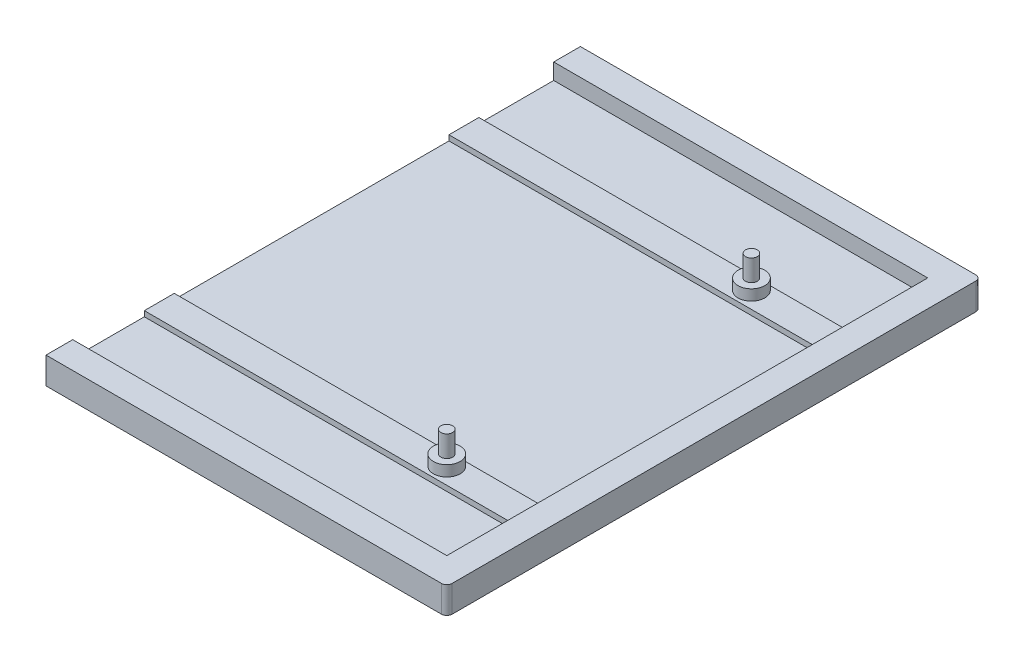
ISO-10303-21;
HEADER;
FILE_DESCRIPTION(('STEP AP214'),'2;1');
FILE_NAME('part.step','',(''),(''),'','','');
FILE_SCHEMA(('AUTOMOTIVE_DESIGN { 1 0 10303 214 1 1 1 1 }'));
ENDSEC;
DATA;
#1=APPLICATION_CONTEXT('core data for automotive mechanical design processes');
#2=APPLICATION_PROTOCOL_DEFINITION('international standard','automotive_design',2000,#1);
#3=PRODUCT_CONTEXT('',#1,'mechanical');
#4=PRODUCT('Part','Part','',(#3));
#5=PRODUCT_RELATED_PRODUCT_CATEGORY('part','',(#4));
#6=PRODUCT_DEFINITION_FORMATION('','',#4);
#7=PRODUCT_DEFINITION_CONTEXT('part definition',#1,'design');
#8=PRODUCT_DEFINITION('design','',#6,#7);
#9=PRODUCT_DEFINITION_SHAPE('','',#8);
#10=(LENGTH_UNIT() NAMED_UNIT(*) SI_UNIT(.MILLI.,.METRE.));
#11=(NAMED_UNIT(*) PLANE_ANGLE_UNIT() SI_UNIT($,.RADIAN.));
#12=(NAMED_UNIT(*) SI_UNIT($,.STERADIAN.) SOLID_ANGLE_UNIT());
#13=UNCERTAINTY_MEASURE_WITH_UNIT(LENGTH_MEASURE(1.E-05),#10,'distance_accuracy_value','');
#14=(GEOMETRIC_REPRESENTATION_CONTEXT(3) GLOBAL_UNCERTAINTY_ASSIGNED_CONTEXT((#13)) GLOBAL_UNIT_ASSIGNED_CONTEXT((#10,
#11,#12)) REPRESENTATION_CONTEXT('',''));
#15=CARTESIAN_POINT('',(0.,0.,0.));
#16=DIRECTION('',(0.,0.,1.));
#17=DIRECTION('',(1.,0.,0.));
#18=AXIS2_PLACEMENT_3D('',#15,#16,#17);
#19=CARTESIAN_POINT('',(283.126221244501,0.,-1.51049784776268E-05));
#20=DIRECTION('',(0.999999999999999,0.,-5.33506872349435E-08));
#21=DIRECTION('',(-5.33506872349435E-08,0.,-0.999999999999999));
#22=AXIS2_PLACEMENT_3D('',#19,#20,#21);
#23=PLANE('',#22);
#24=DIRECTION('',(0.,-1.,0.));
#25=VECTOR('',#24,1.);
#26=CARTESIAN_POINT('',(283.126213326985,5.,-148.405152672559));
#27=LINE('',#26,#25);
#28=CARTESIAN_POINT('',(283.126210659448,5.,-148.405152672559));
#29=VERTEX_POINT('',#28);
#30=CARTESIAN_POINT('',(283.126210659448,0.,-148.405152672559));
#31=VERTEX_POINT('',#30);
#32=EDGE_CURVE('E218',#29,#31,#27,.T.);
#33=ORIENTED_EDGE('',*,*,#32,.F.);
#34=DIRECTION('',(-5.33506872349435E-08,0.,-0.999999999999999));
#35=VECTOR('',#34,1.);
#36=CARTESIAN_POINT('',(283.126221244501,5.,-1.51049784776268E-05));
#37=LINE('',#36,#35);
#38=CARTESIAN_POINT('',(283.126210659448,5.,-153.405153415137));
#39=VERTEX_POINT('',#38);
#40=EDGE_CURVE('E222',#29,#39,#37,.T.);
#41=ORIENTED_EDGE('',*,*,#40,.T.);
#42=DIRECTION('',(0.,-1.,0.));
#43=VECTOR('',#42,1.);
#44=CARTESIAN_POINT('',(283.126213060231,5.,-153.405153415137));
#45=LINE('',#44,#43);
#46=CARTESIAN_POINT('',(283.126212702777,2.,-153.405153415137));
#47=VERTEX_POINT('',#46);
#48=EDGE_CURVE('E219',#39,#47,#45,.T.);
#49=ORIENTED_EDGE('',*,*,#48,.T.);
#50=DIRECTION('',(-5.33506872349435E-08,0.,-0.999999999999999));
#51=VECTOR('',#50,1.);
#52=CARTESIAN_POINT('',(283.126221244501,2.,-1.51049784776268E-05));
#53=LINE('',#52,#51);
#54=CARTESIAN_POINT('',(283.126212702777,2.,-166.805313068658));
#55=VERTEX_POINT('',#54);
#56=EDGE_CURVE('E226',#47,#55,#53,.T.);
#57=ORIENTED_EDGE('',*,*,#56,.T.);
#58=DIRECTION('',(0.,-1.,0.));
#59=VECTOR('',#58,1.);
#60=CARTESIAN_POINT('',(283.126212345323,3.,-166.805313068658));
#61=LINE('',#60,#59);
#62=CARTESIAN_POINT('',(283.126212345323,3.,-166.805313068658));
#63=VERTEX_POINT('',#62);
#64=EDGE_CURVE('E344',#63,#55,#61,.T.);
#65=ORIENTED_EDGE('',*,*,#64,.F.);
#66=DIRECTION('',(5.33506872349435E-08,0.,0.999999999999999));
#67=VECTOR('',#66,1.);
#68=CARTESIAN_POINT('',(283.126221244501,3.,-1.51049784776268E-05));
#69=LINE('',#68,#67);
#70=CARTESIAN_POINT('',(283.12621204656,3.,-172.405304582281));
#71=VERTEX_POINT('',#70);
#72=EDGE_CURVE('E336',#71,#63,#69,.T.);
#73=ORIENTED_EDGE('',*,*,#72,.F.);
#74=DIRECTION('',(0.,1.,0.));
#75=VECTOR('',#74,1.);
#76=CARTESIAN_POINT('',(283.12621204656,3.,-172.405304582281));
#77=LINE('',#76,#75);
#78=CARTESIAN_POINT('',(283.126210675444,2.,-172.405304582281));
#79=VERTEX_POINT('',#78);
#80=EDGE_CURVE('E191',#79,#71,#77,.T.);
#81=ORIENTED_EDGE('',*,*,#80,.F.);
#82=DIRECTION('',(-5.33506872349435E-08,0.,-0.999999999999999));
#83=VECTOR('',#82,1.);
#84=CARTESIAN_POINT('',(283.126221244501,2.,-1.51049784776268E-05));
#85=LINE('',#84,#83);
#86=CARTESIAN_POINT('',(283.126210675444,2.,-223.805428582459));
#87=VERTEX_POINT('',#86);
#88=EDGE_CURVE('E41',#79,#87,#85,.T.);
#89=ORIENTED_EDGE('',*,*,#88,.T.);
#90=DIRECTION('',(0.,-1.,0.));
#91=VECTOR('',#90,1.);
#92=CARTESIAN_POINT('',(283.126209304328,3.,-223.805428582459));
#93=LINE('',#92,#91);
#94=CARTESIAN_POINT('',(283.126209154946,3.,-223.805428582459));
#95=VERTEX_POINT('',#94);
#96=EDGE_CURVE('E180',#95,#87,#93,.T.);
#97=ORIENTED_EDGE('',*,*,#96,.F.);
#98=DIRECTION('',(5.33506872349435E-08,0.,0.999999999999999));
#99=VECTOR('',#98,1.);
#100=CARTESIAN_POINT('',(283.126221244501,3.,-1.51049784776268E-05));
#101=LINE('',#100,#99);
#102=CARTESIAN_POINT('',(283.126209154946,3.,-229.405435317784));
#103=VERTEX_POINT('',#102);
#104=EDGE_CURVE('E352',#103,#95,#101,.T.);
#105=ORIENTED_EDGE('',*,*,#104,.F.);
#106=DIRECTION('',(0.,1.,0.));
#107=VECTOR('',#106,1.);
#108=CARTESIAN_POINT('',(283.126209005564,3.,-229.405435317784));
#109=LINE('',#108,#107);
#110=CARTESIAN_POINT('',(283.126208632114,2.,-229.405435317784));
#111=VERTEX_POINT('',#110);
#112=EDGE_CURVE('E190',#111,#103,#109,.T.);
#113=ORIENTED_EDGE('',*,*,#112,.F.);
#114=DIRECTION('',(-5.33506872349435E-08,0.,-0.999999999999999));
#115=VECTOR('',#114,1.);
#116=CARTESIAN_POINT('',(283.126221244501,2.,-1.51049784776268E-05));
#117=LINE('',#116,#115);
#118=CARTESIAN_POINT('',(283.126208632114,2.,-243.405241308847));
#119=VERTEX_POINT('',#118);
#120=EDGE_CURVE('E196',#111,#119,#117,.T.);
#121=ORIENTED_EDGE('',*,*,#120,.T.);
#122=DIRECTION('',(0.,1.,0.));
#123=VECTOR('',#122,1.);
#124=CARTESIAN_POINT('',(283.126208258665,5.,-243.405241308847));
#125=LINE('',#124,#123);
#126=CARTESIAN_POINT('',(283.126210659448,5.,-243.405241308847));
#127=VERTEX_POINT('',#126);
#128=EDGE_CURVE('E215',#119,#127,#125,.T.);
#129=ORIENTED_EDGE('',*,*,#128,.T.);
#130=CARTESIAN_POINT('',(283.126210659448,5.,-248.405241308848));
#131=VERTEX_POINT('',#130);
#132=EDGE_CURVE('E223',#127,#131,#37,.T.);
#133=ORIENTED_EDGE('',*,*,#132,.T.);
#134=DIRECTION('',(0.,1.,0.));
#135=VECTOR('',#134,1.);
#136=CARTESIAN_POINT('',(283.126207991911,5.,-248.405241308847));
#137=LINE('',#136,#135);
#138=CARTESIAN_POINT('',(283.126210659448,0.,-248.405241308848));
#139=VERTEX_POINT('',#138);
#140=EDGE_CURVE('E349',#139,#131,#137,.T.);
#141=ORIENTED_EDGE('',*,*,#140,.F.);
#142=DIRECTION('',(-5.33506872349435E-08,0.,-0.999999999999999));
#143=VECTOR('',#142,1.);
#144=CARTESIAN_POINT('',(283.126221244501,0.,-1.51049784776268E-05));
#145=LINE('',#144,#143);
#146=EDGE_CURVE('E346',#31,#139,#145,.T.);
#147=ORIENTED_EDGE('',*,*,#146,.F.);
#148=EDGE_LOOP('',(#33,#41,#49,#57,#65,#73,#81,#89,#97,#105,#113,#121,#129,#133,#141,#147));
#149=FACE_BOUND('',#148,.T.);
#150=ADVANCED_FACE('F37',(#149),#23,.F.);
#151=CARTESIAN_POINT('',(0.,9.,0.));
#152=DIRECTION('',(0.,1.,0.));
#153=DIRECTION('',(0.,0.,1.));
#154=AXIS2_PLACEMENT_3D('',#151,#152,#153);
#155=PLANE('',#154);
#156=CARTESIAN_POINT('',(336.626405872607,9.,-226.905435317784));
#157=DIRECTION('',(0.,1.,0.));
#158=DIRECTION('',(0.,0.,1.));
#159=AXIS2_PLACEMENT_3D('',#156,#157,#158);
#160=CIRCLE('',#159,1.10000000000005);
#161=CARTESIAN_POINT('',(336.626405872607,9.,-225.805435317784));
#162=VERTEX_POINT('',#161);
#163=EDGE_CURVE('E321',#162,#162,#160,.T.);
#164=ORIENTED_EDGE('',*,*,#163,.T.);
#165=EDGE_LOOP('',(#164));
#166=FACE_BOUND('',#165,.T.);
#167=ADVANCED_FACE('F430',(#166),#155,.T.);
#168=CARTESIAN_POINT('',(0.,9.,0.));
#169=DIRECTION('',(0.,1.,0.));
#170=DIRECTION('',(0.,0.,1.));
#171=AXIS2_PLACEMENT_3D('',#168,#169,#170);
#172=PLANE('',#171);
#173=CARTESIAN_POINT('',(336.626405872607,9.,-169.905319803983));
#174=DIRECTION('',(0.,1.,0.));
#175=DIRECTION('',(0.,0.,1.));
#176=AXIS2_PLACEMENT_3D('',#173,#174,#175);
#177=CIRCLE('',#176,1.10000000000005);
#178=CARTESIAN_POINT('',(336.626405872607,9.,-168.805319803983));
#179=VERTEX_POINT('',#178);
#180=EDGE_CURVE('E11',#179,#179,#177,.T.);
#181=ORIENTED_EDGE('',*,*,#180,.T.);
#182=EDGE_LOOP('',(#181));
#183=FACE_BOUND('',#182,.T.);
#184=ADVANCED_FACE('F435',(#183),#172,.T.);
#185=CARTESIAN_POINT('',(336.626405872607,9.,-226.905435317784));
#186=DIRECTION('',(0.,-1.,0.));
#187=DIRECTION('',(0.,0.,-1.));
#188=AXIS2_PLACEMENT_3D('',#185,#186,#187);
#189=CYLINDRICAL_SURFACE('',#188,1.10000000000005);
#190=ORIENTED_EDGE('',*,*,#163,.F.);
#191=EDGE_LOOP('',(#190));
#192=FACE_BOUND('',#191,.T.);
#193=CARTESIAN_POINT('',(336.626405872607,5.,-226.905435317784));
#194=DIRECTION('',(0.,1.,0.));
#195=DIRECTION('',(0.,0.,1.));
#196=AXIS2_PLACEMENT_3D('',#193,#194,#195);
#197=CIRCLE('',#196,1.10000000000005);
#198=CARTESIAN_POINT('',(336.626405872607,5.,-225.805435317784));
#199=VERTEX_POINT('',#198);
#200=EDGE_CURVE('E318',#199,#199,#197,.T.);
#201=ORIENTED_EDGE('',*,*,#200,.T.);
#202=EDGE_LOOP('',(#201));
#203=FACE_BOUND('',#202,.T.);
#204=ADVANCED_FACE('F464',(#192,#203),#189,.T.);
#205=CARTESIAN_POINT('',(336.626405872607,9.,-169.905319803983));
#206=DIRECTION('',(0.,-1.,0.));
#207=DIRECTION('',(0.,0.,-1.));
#208=AXIS2_PLACEMENT_3D('',#205,#206,#207);
#209=CYLINDRICAL_SURFACE('',#208,1.10000000000005);
#210=ORIENTED_EDGE('',*,*,#180,.F.);
#211=EDGE_LOOP('',(#210));
#212=FACE_BOUND('',#211,.T.);
#213=CARTESIAN_POINT('',(336.626405872607,5.,-169.905319803983));
#214=DIRECTION('',(0.,1.,0.));
#215=DIRECTION('',(0.,0.,1.));
#216=AXIS2_PLACEMENT_3D('',#213,#214,#215);
#217=CIRCLE('',#216,1.10000000000005);
#218=CARTESIAN_POINT('',(336.626405872607,5.,-168.805319803983));
#219=VERTEX_POINT('',#218);
#220=EDGE_CURVE('E46',#219,#219,#217,.T.);
#221=ORIENTED_EDGE('',*,*,#220,.T.);
#222=EDGE_LOOP('',(#221));
#223=FACE_BOUND('',#222,.T.);
#224=ADVANCED_FACE('F462',(#212,#223),#209,.T.);
#225=CARTESIAN_POINT('',(0.,5.,0.));
#226=DIRECTION('',(0.,1.,0.));
#227=DIRECTION('',(0.,0.,1.));
#228=AXIS2_PLACEMENT_3D('',#225,#226,#227);
#229=PLANE('',#228);
#230=ORIENTED_EDGE('',*,*,#200,.F.);
#231=EDGE_LOOP('',(#230));
#232=FACE_BOUND('',#231,.T.);
#233=CARTESIAN_POINT('',(336.626405872607,5.,-226.905435317784));
#234=DIRECTION('',(0.,1.,0.));
#235=DIRECTION('',(0.,0.,1.));
#236=AXIS2_PLACEMENT_3D('',#233,#234,#235);
#237=CIRCLE('',#236,2.50000000000002);
#238=CARTESIAN_POINT('',(336.626405872607,5.,-224.405435317784));
#239=VERTEX_POINT('',#238);
#240=EDGE_CURVE('E205',#239,#239,#237,.T.);
#241=ORIENTED_EDGE('',*,*,#240,.T.);
#242=EDGE_LOOP('',(#241));
#243=FACE_BOUND('',#242,.T.);
#244=ADVANCED_FACE('F458',(#232,#243),#229,.T.);
#245=CARTESIAN_POINT('',(0.,5.,0.));
#246=DIRECTION('',(0.,1.,0.));
#247=DIRECTION('',(0.,0.,1.));
#248=AXIS2_PLACEMENT_3D('',#245,#246,#247);
#249=PLANE('',#248);
#250=ORIENTED_EDGE('',*,*,#220,.F.);
#251=EDGE_LOOP('',(#250));
#252=FACE_BOUND('',#251,.T.);
#253=CARTESIAN_POINT('',(336.626405872607,5.,-169.905319803983));
#254=DIRECTION('',(0.,1.,0.));
#255=DIRECTION('',(0.,0.,1.));
#256=AXIS2_PLACEMENT_3D('',#253,#254,#255);
#257=CIRCLE('',#256,2.50000000000002);
#258=CARTESIAN_POINT('',(336.626405872607,5.,-167.405319803983));
#259=VERTEX_POINT('',#258);
#260=EDGE_CURVE('E272',#259,#259,#257,.T.);
#261=ORIENTED_EDGE('',*,*,#260,.T.);
#262=EDGE_LOOP('',(#261));
#263=FACE_BOUND('',#262,.T.);
#264=ADVANCED_FACE('F461',(#252,#263),#249,.T.);
#265=CARTESIAN_POINT('',(0.,3.,0.));
#266=DIRECTION('',(0.,-1.,0.));
#267=DIRECTION('',(0.,0.,-1.));
#268=AXIS2_PLACEMENT_3D('',#265,#266,#267);
#269=PLANE('',#268);
#270=DIRECTION('',(-1.,0.,0.));
#271=VECTOR('',#270,1.);
#272=CARTESIAN_POINT('',(54.1264415400261,3.,-172.405304582281));
#273=LINE('',#272,#271);
#274=CARTESIAN_POINT('',(336.617681866791,3.,-172.405304582281));
#275=VERTEX_POINT('',#274);
#276=EDGE_CURVE('E255',#275,#71,#273,.T.);
#277=ORIENTED_EDGE('',*,*,#276,.T.);
#278=ORIENTED_EDGE('',*,*,#72,.T.);
#279=DIRECTION('',(1.,0.,0.));
#280=VECTOR('',#279,1.);
#281=CARTESIAN_POINT('',(353.126212345323,3.,-166.805313068658));
#282=LINE('',#281,#280);
#283=CARTESIAN_POINT('',(353.126212345323,3.,-166.805313068658));
#284=VERTEX_POINT('',#283);
#285=EDGE_CURVE('E211',#63,#284,#282,.T.);
#286=ORIENTED_EDGE('',*,*,#285,.T.);
#287=DIRECTION('',(-5.33506885107468E-08,0.,-0.999999999999999));
#288=VECTOR('',#287,1.);
#289=CARTESIAN_POINT('',(353.12621204656,3.,-172.405304582281));
#290=LINE('',#289,#288);
#291=CARTESIAN_POINT('',(353.12621204656,3.,-172.405304582281));
#292=VERTEX_POINT('',#291);
#293=EDGE_CURVE('E258',#284,#292,#290,.T.);
#294=ORIENTED_EDGE('',*,*,#293,.T.);
#295=CARTESIAN_POINT('',(336.635129878423,3.,-172.405304582281));
#296=VERTEX_POINT('',#295);
#297=EDGE_CURVE('E252',#292,#296,#273,.T.);
#298=ORIENTED_EDGE('',*,*,#297,.T.);
#299=CARTESIAN_POINT('',(336.626405872607,3.,-169.905319803983));
#300=DIRECTION('',(0.,-1.,0.));
#301=DIRECTION('',(0.,0.,-1.));
#302=AXIS2_PLACEMENT_3D('',#299,#300,#301);
#303=CIRCLE('',#302,2.50000000000002);
#304=EDGE_CURVE('E62',#275,#296,#303,.F.);
#305=ORIENTED_EDGE('',*,*,#304,.F.);
#306=EDGE_LOOP('',(#277,#278,#286,#294,#298,#305));
#307=FACE_BOUND('',#306,.T.);
#308=ADVANCED_FACE('F334',(#307),#269,.F.);
#309=CARTESIAN_POINT('',(336.626405872607,5.,-226.905435317784));
#310=DIRECTION('',(0.,-1.,0.));
#311=DIRECTION('',(0.,0.,-1.));
#312=AXIS2_PLACEMENT_3D('',#309,#310,#311);
#313=CYLINDRICAL_SURFACE('',#312,2.50000000000002);
#314=ORIENTED_EDGE('',*,*,#240,.F.);
#315=EDGE_LOOP('',(#314));
#316=FACE_BOUND('',#315,.T.);
#317=CARTESIAN_POINT('',(336.626405872607,3.,-226.905435317784));
#318=DIRECTION('',(0.,-1.,0.));
#319=DIRECTION('',(0.,0.,-1.));
#320=AXIS2_PLACEMENT_3D('',#317,#318,#319);
#321=CIRCLE('',#320,2.50000000000002);
#322=CARTESIAN_POINT('',(336.626405872607,3.,-229.405435317784));
#323=VERTEX_POINT('',#322);
#324=EDGE_CURVE('E201',#323,#323,#321,.F.);
#325=ORIENTED_EDGE('',*,*,#324,.T.);
#326=EDGE_LOOP('',(#325));
#327=FACE_BOUND('',#326,.T.);
#328=ADVANCED_FACE('F454',(#316,#327),#313,.T.);
#329=CARTESIAN_POINT('',(353.126212345323,3.,-166.805313068658));
#330=DIRECTION('',(0.,0.,-1.));
#331=DIRECTION('',(-1.,0.,0.));
#332=AXIS2_PLACEMENT_3D('',#329,#330,#331);
#333=PLANE('',#332);
#334=ORIENTED_EDGE('',*,*,#285,.F.);
#335=ORIENTED_EDGE('',*,*,#64,.T.);
#336=DIRECTION('',(1.,0.,0.));
#337=VECTOR('',#336,1.);
#338=CARTESIAN_POINT('',(353.126212345323,2.,-166.805313068658));
#339=LINE('',#338,#337);
#340=CARTESIAN_POINT('',(353.126212345323,2.,-166.805313068658));
#341=VERTEX_POINT('',#340);
#342=EDGE_CURVE('E256',#55,#341,#339,.T.);
#343=ORIENTED_EDGE('',*,*,#342,.T.);
#344=DIRECTION('',(0.,-1.,0.));
#345=VECTOR('',#344,1.);
#346=CARTESIAN_POINT('',(353.126212345323,3.,-166.805313068658));
#347=LINE('',#346,#345);
#348=EDGE_CURVE('E325',#284,#341,#347,.T.);
#349=ORIENTED_EDGE('',*,*,#348,.F.);
#350=EDGE_LOOP('',(#334,#335,#343,#349));
#351=FACE_BOUND('',#350,.T.);
#352=ADVANCED_FACE('F339',(#351),#333,.F.);
#353=CARTESIAN_POINT('',(-4.63593180367697E-06,5.,-243.405235916384));
#354=DIRECTION('',(1.90461465885209E-08,0.,1.));
#355=DIRECTION('',(1.,0.,-1.90461465885209E-08));
#356=AXIS2_PLACEMENT_3D('',#353,#354,#355);
#357=PLANE('',#356);
#358=ORIENTED_EDGE('',*,*,#128,.F.);
#359=DIRECTION('',(-1.,0.,1.90461465885209E-08));
#360=VECTOR('',#359,1.);
#361=CARTESIAN_POINT('',(-4.63593180367697E-06,2.,-243.405235916384));
#362=LINE('',#361,#360);
#363=CARTESIAN_POINT('',(353.126208258665,2.,-243.405242642078));
#364=VERTEX_POINT('',#363);
#365=EDGE_CURVE('E234',#364,#119,#362,.T.);
#366=ORIENTED_EDGE('',*,*,#365,.F.);
#367=DIRECTION('',(0.,-1.,0.));
#368=VECTOR('',#367,1.);
#369=CARTESIAN_POINT('',(353.126208258665,5.,-243.405242642078));
#370=LINE('',#369,#368);
#371=CARTESIAN_POINT('',(353.126208258665,5.,-243.405242642078));
#372=VERTEX_POINT('',#371);
#373=EDGE_CURVE('E281',#372,#364,#370,.T.);
#374=ORIENTED_EDGE('',*,*,#373,.F.);
#375=DIRECTION('',(-1.,0.,1.90461465885209E-08));
#376=VECTOR('',#375,1.);
#377=CARTESIAN_POINT('',(-4.63593180367697E-06,5.,-243.405235916384));
#378=LINE('',#377,#376);
#379=EDGE_CURVE('E284',#372,#127,#378,.T.);
#380=ORIENTED_EDGE('',*,*,#379,.T.);
#381=EDGE_LOOP('',(#358,#366,#374,#380));
#382=FACE_BOUND('',#381,.T.);
#383=ADVANCED_FACE('F408',(#382),#357,.T.);
#384=CARTESIAN_POINT('',(54.1264415400261,3.,-223.805428582459));
#385=DIRECTION('',(0.,0.,-1.));
#386=DIRECTION('',(-1.,0.,0.));
#387=AXIS2_PLACEMENT_3D('',#384,#385,#386);
#388=PLANE('',#387);
#389=DIRECTION('',(1.,0.,0.));
#390=VECTOR('',#389,1.);
#391=CARTESIAN_POINT('',(54.1264415400261,3.,-223.805428582459));
#392=LINE('',#391,#390);
#393=CARTESIAN_POINT('',(353.126209304328,3.,-223.805428582459));
#394=VERTEX_POINT('',#393);
#395=EDGE_CURVE('E187',#95,#394,#392,.T.);
#396=ORIENTED_EDGE('',*,*,#395,.F.);
#397=ORIENTED_EDGE('',*,*,#96,.T.);
#398=DIRECTION('',(1.,0.,0.));
#399=VECTOR('',#398,1.);
#400=CARTESIAN_POINT('',(54.1264415400261,2.,-223.805428582459));
#401=LINE('',#400,#399);
#402=CARTESIAN_POINT('',(353.126209304328,2.,-223.805428582459));
#403=VERTEX_POINT('',#402);
#404=EDGE_CURVE('E185',#87,#403,#401,.T.);
#405=ORIENTED_EDGE('',*,*,#404,.T.);
#406=DIRECTION('',(0.,-1.,0.));
#407=VECTOR('',#406,1.);
#408=CARTESIAN_POINT('',(353.126209304328,3.,-223.805428582459));
#409=LINE('',#408,#407);
#410=EDGE_CURVE('E307',#394,#403,#409,.T.);
#411=ORIENTED_EDGE('',*,*,#410,.F.);
#412=EDGE_LOOP('',(#396,#397,#405,#411));
#413=FACE_BOUND('',#412,.T.);
#414=ADVANCED_FACE('F182',(#413),#388,.F.);
#415=CARTESIAN_POINT('',(353.126221244501,5.,-1.88395267128549E-05));
#416=DIRECTION('',(-0.999999999999999,0.,5.33506875996349E-08));
#417=DIRECTION('',(5.33506875996349E-08,0.,0.999999999999999));
#418=AXIS2_PLACEMENT_3D('',#415,#416,#417);
#419=PLANE('',#418);
#420=DIRECTION('',(-5.33506875996349E-08,0.,-0.999999999999999));
#421=VECTOR('',#420,1.);
#422=CARTESIAN_POINT('',(353.126221244501,2.,-1.88395267128549E-05));
#423=LINE('',#422,#421);
#424=CARTESIAN_POINT('',(353.126209005564,2.,-229.405435317784));
#425=VERTEX_POINT('',#424);
#426=EDGE_CURVE('E237',#425,#364,#423,.T.);
#427=ORIENTED_EDGE('',*,*,#426,.F.);
#428=DIRECTION('',(0.,-1.,0.));
#429=VECTOR('',#428,1.);
#430=CARTESIAN_POINT('',(353.126209005564,3.,-229.405435317784));
#431=LINE('',#430,#429);
#432=CARTESIAN_POINT('',(353.126209005564,3.,-229.405435317784));
#433=VERTEX_POINT('',#432);
#434=EDGE_CURVE('E309',#433,#425,#431,.T.);
#435=ORIENTED_EDGE('',*,*,#434,.F.);
#436=DIRECTION('',(-5.33506921855642E-08,0.,-0.999999999999999));
#437=VECTOR('',#436,1.);
#438=CARTESIAN_POINT('',(353.126209005564,3.,-229.405435317784));
#439=LINE('',#438,#437);
#440=EDGE_CURVE('E214',#394,#433,#439,.T.);
#441=ORIENTED_EDGE('',*,*,#440,.F.);
#442=ORIENTED_EDGE('',*,*,#410,.T.);
#443=CARTESIAN_POINT('',(353.12621204656,2.,-172.405304582281));
#444=VERTEX_POINT('',#443);
#445=EDGE_CURVE('E199',#444,#403,#423,.T.);
#446=ORIENTED_EDGE('',*,*,#445,.F.);
#447=DIRECTION('',(0.,-1.,0.));
#448=VECTOR('',#447,1.);
#449=CARTESIAN_POINT('',(353.12621204656,3.,-172.405304582281));
#450=LINE('',#449,#448);
#451=EDGE_CURVE('E324',#292,#444,#450,.T.);
#452=ORIENTED_EDGE('',*,*,#451,.F.);
#453=ORIENTED_EDGE('',*,*,#293,.F.);
#454=ORIENTED_EDGE('',*,*,#348,.T.);
#455=CARTESIAN_POINT('',(353.126213060231,2.,-153.405153415137));
#456=VERTEX_POINT('',#455);
#457=EDGE_CURVE('E240',#456,#341,#423,.T.);
#458=ORIENTED_EDGE('',*,*,#457,.F.);
#459=DIRECTION('',(0.,-1.,0.));
#460=VECTOR('',#459,1.);
#461=CARTESIAN_POINT('',(353.126213060231,5.,-153.405153415137));
#462=LINE('',#461,#460);
#463=CARTESIAN_POINT('',(353.126213060231,5.,-153.405153415137));
#464=VERTEX_POINT('',#463);
#465=EDGE_CURVE('E355',#464,#456,#462,.T.);
#466=ORIENTED_EDGE('',*,*,#465,.F.);
#467=DIRECTION('',(-5.33506875996349E-08,0.,-0.999999999999999));
#468=VECTOR('',#467,1.);
#469=CARTESIAN_POINT('',(353.126221244501,5.,-1.88395267128549E-05));
#470=LINE('',#469,#468);
#471=EDGE_CURVE('E288',#464,#372,#470,.T.);
#472=ORIENTED_EDGE('',*,*,#471,.T.);
#473=ORIENTED_EDGE('',*,*,#373,.T.);
#474=EDGE_LOOP('',(#427,#435,#441,#442,#446,#452,#453,#454,#458,#466,#472,#473));
#475=FACE_BOUND('',#474,.T.);
#476=ADVANCED_FACE('F341',(#475),#419,.T.);
#477=CARTESIAN_POINT('',(54.1264415400261,3.,-172.405304582281));
#478=DIRECTION('',(0.,0.,1.));
#479=DIRECTION('',(1.,0.,0.));
#480=AXIS2_PLACEMENT_3D('',#477,#478,#479);
#481=PLANE('',#480);
#482=DIRECTION('',(0.,-1.,0.));
#483=VECTOR('',#482,1.);
#484=CARTESIAN_POINT('',(336.635129878423,5.,-172.405304582281));
#485=LINE('',#484,#483);
#486=CARTESIAN_POINT('',(336.635129878423,2.,-172.405304582281));
#487=VERTEX_POINT('',#486);
#488=EDGE_CURVE('E266',#296,#487,#485,.T.);
#489=ORIENTED_EDGE('',*,*,#488,.F.);
#490=ORIENTED_EDGE('',*,*,#297,.F.);
#491=ORIENTED_EDGE('',*,*,#451,.T.);
#492=DIRECTION('',(-1.,0.,0.));
#493=VECTOR('',#492,1.);
#494=CARTESIAN_POINT('',(54.1264415400261,2.,-172.405304582281));
#495=LINE('',#494,#493);
#496=EDGE_CURVE('E257',#444,#487,#495,.T.);
#497=ORIENTED_EDGE('',*,*,#496,.T.);
#498=EDGE_LOOP('',(#489,#490,#491,#497));
#499=FACE_BOUND('',#498,.T.);
#500=ADVANCED_FACE('F441',(#499),#481,.F.);
#501=CARTESIAN_POINT('',(336.626405872607,5.,-169.905319803983));
#502=DIRECTION('',(0.,-1.,0.));
#503=DIRECTION('',(0.,0.,-1.));
#504=AXIS2_PLACEMENT_3D('',#501,#502,#503);
#505=CYLINDRICAL_SURFACE('',#504,2.50000000000002);
#506=CARTESIAN_POINT('',(336.626405872607,2.,-169.905319803983));
#507=DIRECTION('',(0.,1.,0.));
#508=DIRECTION('',(0.,0.,1.));
#509=AXIS2_PLACEMENT_3D('',#506,#507,#508);
#510=CIRCLE('',#509,2.50000000000002);
#511=CARTESIAN_POINT('',(336.617681866791,2.,-172.405304582281));
#512=VERTEX_POINT('',#511);
#513=EDGE_CURVE('E251',#487,#512,#510,.T.);
#514=ORIENTED_EDGE('',*,*,#513,.T.);
#515=DIRECTION('',(0.,-1.,0.));
#516=VECTOR('',#515,1.);
#517=CARTESIAN_POINT('',(336.617681866791,5.,-172.405304582281));
#518=LINE('',#517,#516);
#519=EDGE_CURVE('E264',#512,#275,#518,.F.);
#520=ORIENTED_EDGE('',*,*,#519,.T.);
#521=ORIENTED_EDGE('',*,*,#304,.T.);
#522=ORIENTED_EDGE('',*,*,#488,.T.);
#523=EDGE_LOOP('',(#514,#520,#521,#522));
#524=FACE_BOUND('',#523,.T.);
#525=ORIENTED_EDGE('',*,*,#260,.F.);
#526=EDGE_LOOP('',(#525));
#527=FACE_BOUND('',#526,.T.);
#528=ADVANCED_FACE('F468',(#524,#527),#505,.T.);
#529=EDGE_CURVE('E54',#512,#79,#495,.T.);
#530=ORIENTED_EDGE('',*,*,#529,.T.);
#531=ORIENTED_EDGE('',*,*,#80,.T.);
#532=ORIENTED_EDGE('',*,*,#276,.F.);
#533=ORIENTED_EDGE('',*,*,#519,.F.);
#534=EDGE_LOOP('',(#530,#531,#532,#533));
#535=FACE_BOUND('',#534,.T.);
#536=ADVANCED_FACE('F343',(#535),#481,.F.);
#537=CARTESIAN_POINT('',(0.,2.,0.));
#538=DIRECTION('',(0.,1.,0.));
#539=DIRECTION('',(0.,0.,1.));
#540=AXIS2_PLACEMENT_3D('',#537,#538,#539);
#541=PLANE('',#540);
#542=ORIENTED_EDGE('',*,*,#88,.F.);
#543=ORIENTED_EDGE('',*,*,#529,.F.);
#544=ORIENTED_EDGE('',*,*,#513,.F.);
#545=ORIENTED_EDGE('',*,*,#496,.F.);
#546=ORIENTED_EDGE('',*,*,#445,.T.);
#547=ORIENTED_EDGE('',*,*,#404,.F.);
#548=EDGE_LOOP('',(#542,#543,#544,#545,#546,#547));
#549=FACE_BOUND('',#548,.T.);
#550=ADVANCED_FACE('F197',(#549),#541,.T.);
#551=CARTESIAN_POINT('',(54.1264415400261,3.,-229.405435317784));
#552=DIRECTION('',(0.,0.,1.));
#553=DIRECTION('',(1.,0.,0.));
#554=AXIS2_PLACEMENT_3D('',#551,#552,#553);
#555=PLANE('',#554);
#556=DIRECTION('',(-1.,0.,0.));
#557=VECTOR('',#556,1.);
#558=CARTESIAN_POINT('',(54.1264415400261,2.,-229.405435317784));
#559=LINE('',#558,#557);
#560=EDGE_CURVE('E202',#425,#111,#559,.T.);
#561=ORIENTED_EDGE('',*,*,#560,.T.);
#562=ORIENTED_EDGE('',*,*,#112,.T.);
#563=DIRECTION('',(-1.,0.,0.));
#564=VECTOR('',#563,1.);
#565=CARTESIAN_POINT('',(54.1264415400261,3.,-229.405435317784));
#566=LINE('',#565,#564);
#567=EDGE_CURVE('E314',#323,#103,#566,.T.);
#568=ORIENTED_EDGE('',*,*,#567,.F.);
#569=EDGE_CURVE('E311',#433,#323,#566,.T.);
#570=ORIENTED_EDGE('',*,*,#569,.F.);
#571=ORIENTED_EDGE('',*,*,#434,.T.);
#572=EDGE_LOOP('',(#561,#562,#568,#570,#571));
#573=FACE_BOUND('',#572,.T.);
#574=ADVANCED_FACE('F405',(#573),#555,.F.);
#575=ORIENTED_EDGE('',*,*,#120,.F.);
#576=ORIENTED_EDGE('',*,*,#560,.F.);
#577=ORIENTED_EDGE('',*,*,#426,.T.);
#578=ORIENTED_EDGE('',*,*,#365,.T.);
#579=EDGE_LOOP('',(#575,#576,#577,#578));
#580=FACE_BOUND('',#579,.T.);
#581=ADVANCED_FACE('F235',(#580),#541,.T.);
#582=CARTESIAN_POINT('',(0.,5.,-153.405153415137));
#583=DIRECTION('',(0.,0.,-1.));
#584=DIRECTION('',(-1.,0.,0.));
#585=AXIS2_PLACEMENT_3D('',#582,#583,#584);
#586=PLANE('',#585);
#587=ORIENTED_EDGE('',*,*,#48,.F.);
#588=DIRECTION('',(1.,0.,0.));
#589=VECTOR('',#588,1.);
#590=CARTESIAN_POINT('',(0.,5.,-153.405153415137));
#591=LINE('',#590,#589);
#592=EDGE_CURVE('E287',#39,#464,#591,.T.);
#593=ORIENTED_EDGE('',*,*,#592,.T.);
#594=ORIENTED_EDGE('',*,*,#465,.T.);
#595=DIRECTION('',(1.,0.,0.));
#596=VECTOR('',#595,1.);
#597=CARTESIAN_POINT('',(0.,2.,-153.405153415137));
#598=LINE('',#597,#596);
#599=EDGE_CURVE('E249',#47,#456,#598,.T.);
#600=ORIENTED_EDGE('',*,*,#599,.F.);
#601=EDGE_LOOP('',(#587,#593,#594,#600));
#602=FACE_BOUND('',#601,.T.);
#603=ADVANCED_FACE('F412',(#602),#586,.T.);
#604=ORIENTED_EDGE('',*,*,#56,.F.);
#605=ORIENTED_EDGE('',*,*,#599,.T.);
#606=ORIENTED_EDGE('',*,*,#457,.T.);
#607=ORIENTED_EDGE('',*,*,#342,.F.);
#608=EDGE_LOOP('',(#604,#605,#606,#607));
#609=FACE_BOUND('',#608,.T.);
#610=ADVANCED_FACE('F39',(#609),#541,.T.);
#611=CARTESIAN_POINT('',(0.,3.,0.));
#612=DIRECTION('',(0.,-1.,0.));
#613=DIRECTION('',(0.,0.,-1.));
#614=AXIS2_PLACEMENT_3D('',#611,#612,#613);
#615=PLANE('',#614);
#616=ORIENTED_EDGE('',*,*,#567,.T.);
#617=ORIENTED_EDGE('',*,*,#104,.T.);
#618=ORIENTED_EDGE('',*,*,#395,.T.);
#619=ORIENTED_EDGE('',*,*,#440,.T.);
#620=ORIENTED_EDGE('',*,*,#569,.T.);
#621=ORIENTED_EDGE('',*,*,#324,.F.);
#622=EDGE_LOOP('',(#616,#617,#618,#619,#620,#621));
#623=FACE_BOUND('',#622,.T.);
#624=ADVANCED_FACE('F402',(#623),#615,.F.);
#625=CARTESIAN_POINT('',(357.11021327278,5.,-149.421152672559));
#626=DIRECTION('',(0.,-1.,0.));
#627=DIRECTION('',(0.,0.,-1.));
#628=AXIS2_PLACEMENT_3D('',#625,#626,#627);
#629=CYLINDRICAL_SURFACE('',#628,1.01600000000006);
#630=CARTESIAN_POINT('',(357.11021327278,0.,-149.421152672559));
#631=DIRECTION('',(0.,1.,0.));
#632=DIRECTION('',(0.,0.,1.));
#633=AXIS2_PLACEMENT_3D('',#630,#631,#632);
#634=CIRCLE('',#633,1.01600000000006);
#635=CARTESIAN_POINT('',(357.11021327278,0.,-148.405152672559));
#636=VERTEX_POINT('',#635);
#637=CARTESIAN_POINT('',(358.12621327278,0.,-149.421152672559));
#638=VERTEX_POINT('',#637);
#639=EDGE_CURVE('E245',#636,#638,#634,.T.);
#640=ORIENTED_EDGE('',*,*,#639,.T.);
#641=DIRECTION('',(0.,-1.,0.));
#642=VECTOR('',#641,1.);
#643=CARTESIAN_POINT('',(358.12621327278,5.,-149.421152672559));
#644=LINE('',#643,#642);
#645=CARTESIAN_POINT('',(358.12621327278,5.,-149.421152672559));
#646=VERTEX_POINT('',#645);
#647=EDGE_CURVE('E363',#646,#638,#644,.T.);
#648=ORIENTED_EDGE('',*,*,#647,.F.);
#649=CARTESIAN_POINT('',(357.11021327278,5.,-149.421152672559));
#650=DIRECTION('',(0.,1.,0.));
#651=DIRECTION('',(0.,0.,1.));
#652=AXIS2_PLACEMENT_3D('',#649,#650,#651);
#653=CIRCLE('',#652,1.01600000000006);
#654=CARTESIAN_POINT('',(357.11021327278,5.,-148.405152672559));
#655=VERTEX_POINT('',#654);
#656=EDGE_CURVE('E285',#655,#646,#653,.T.);
#657=ORIENTED_EDGE('',*,*,#656,.F.);
#658=DIRECTION('',(0.,-1.,0.));
#659=VECTOR('',#658,1.);
#660=CARTESIAN_POINT('',(357.11021327278,5.,-148.405152672559));
#661=LINE('',#660,#659);
#662=EDGE_CURVE('E360',#655,#636,#661,.T.);
#663=ORIENTED_EDGE('',*,*,#662,.T.);
#664=EDGE_LOOP('',(#640,#648,#657,#663));
#665=FACE_BOUND('',#664,.T.);
#666=ADVANCED_FACE('F382',(#665),#629,.T.);
#667=CARTESIAN_POINT('',(358.1262212445,5.,-1.91062800202476E-05));
#668=DIRECTION('',(-0.999999999999999,0.,5.33506872349435E-08));
#669=DIRECTION('',(5.33506872349435E-08,0.,0.999999999999999));
#670=AXIS2_PLACEMENT_3D('',#667,#668,#669);
#671=PLANE('',#670);
#672=DIRECTION('',(-5.33506872349435E-08,0.,-0.999999999999999));
#673=VECTOR('',#672,1.);
#674=CARTESIAN_POINT('',(358.1262212445,0.,-1.91062800202476E-05));
#675=LINE('',#674,#673);
#676=CARTESIAN_POINT('',(358.126208046115,0.,-247.389245898885));
#677=VERTEX_POINT('',#676);
#678=EDGE_CURVE('E295',#638,#677,#675,.T.);
#679=ORIENTED_EDGE('',*,*,#678,.T.);
#680=DIRECTION('',(0.,-1.,0.));
#681=VECTOR('',#680,1.);
#682=CARTESIAN_POINT('',(358.126208046115,5.,-247.389245898885));
#683=LINE('',#682,#681);
#684=CARTESIAN_POINT('',(358.126208046115,5.,-247.389245898885));
#685=VERTEX_POINT('',#684);
#686=EDGE_CURVE('E366',#685,#677,#683,.T.);
#687=ORIENTED_EDGE('',*,*,#686,.F.);
#688=DIRECTION('',(-5.33506872349435E-08,0.,-0.999999999999999));
#689=VECTOR('',#688,1.);
#690=CARTESIAN_POINT('',(358.1262212445,5.,-1.91062800202476E-05));
#691=LINE('',#690,#689);
#692=EDGE_CURVE('E372',#646,#685,#691,.T.);
#693=ORIENTED_EDGE('',*,*,#692,.F.);
#694=ORIENTED_EDGE('',*,*,#647,.T.);
#695=EDGE_LOOP('',(#679,#687,#693,#694));
#696=FACE_BOUND('',#695,.T.);
#697=ADVANCED_FACE('F386',(#696),#671,.F.);
#698=CARTESIAN_POINT('',(357.11020804612,5.,-247.389242717971));
#699=DIRECTION('',(0.,-1.,0.));
#700=DIRECTION('',(0.,0.,-1.));
#701=AXIS2_PLACEMENT_3D('',#698,#699,#700);
#702=CYLINDRICAL_SURFACE('',#701,1.01600000000003);
#703=CARTESIAN_POINT('',(357.11020804612,0.,-247.389242717971));
#704=DIRECTION('',(0.,1.,0.));
#705=DIRECTION('',(0.,0.,1.));
#706=AXIS2_PLACEMENT_3D('',#703,#704,#705);
#707=CIRCLE('',#706,1.01600000000003);
#708=CARTESIAN_POINT('',(357.11021327278,0.,-248.405242717958));
#709=VERTEX_POINT('',#708);
#710=EDGE_CURVE('E291',#677,#709,#707,.T.);
#711=ORIENTED_EDGE('',*,*,#710,.T.);
#712=DIRECTION('',(0.,-1.,0.));
#713=VECTOR('',#712,1.);
#714=CARTESIAN_POINT('',(357.11021327278,5.,-248.405242717958));
#715=LINE('',#714,#713);
#716=CARTESIAN_POINT('',(357.11021327278,5.,-248.405242717958));
#717=VERTEX_POINT('',#716);
#718=EDGE_CURVE('E358',#717,#709,#715,.T.);
#719=ORIENTED_EDGE('',*,*,#718,.F.);
#720=CARTESIAN_POINT('',(357.11020804612,5.,-247.389242717971));
#721=DIRECTION('',(0.,1.,0.));
#722=DIRECTION('',(0.,0.,1.));
#723=AXIS2_PLACEMENT_3D('',#720,#721,#722);
#724=CIRCLE('',#723,1.01600000000003);
#725=EDGE_CURVE('E280',#685,#717,#724,.T.);
#726=ORIENTED_EDGE('',*,*,#725,.F.);
#727=ORIENTED_EDGE('',*,*,#686,.T.);
#728=EDGE_LOOP('',(#711,#719,#726,#727));
#729=FACE_BOUND('',#728,.T.);
#730=ADVANCED_FACE('F391',(#729),#702,.T.);
#731=CARTESIAN_POINT('',(-4.73116262178461E-06,5.,-248.405235916384));
#732=DIRECTION('',(1.90461469313681E-08,0.,1.));
#733=DIRECTION('',(1.,0.,-1.90461469313681E-08));
#734=AXIS2_PLACEMENT_3D('',#731,#732,#733);
#735=PLANE('',#734);
#736=DIRECTION('',(-1.,0.,1.90461469313681E-08));
#737=VECTOR('',#736,1.);
#738=CARTESIAN_POINT('',(-4.73116262178461E-06,0.,-248.405235916384));
#739=LINE('',#738,#737);
#740=EDGE_CURVE('E289',#709,#139,#739,.T.);
#741=ORIENTED_EDGE('',*,*,#740,.T.);
#742=ORIENTED_EDGE('',*,*,#140,.T.);
#743=DIRECTION('',(-1.,0.,1.90461469313681E-08));
#744=VECTOR('',#743,1.);
#745=CARTESIAN_POINT('',(-4.73116262178461E-06,5.,-248.405235916384));
#746=LINE('',#745,#744);
#747=EDGE_CURVE('E277',#717,#131,#746,.T.);
#748=ORIENTED_EDGE('',*,*,#747,.F.);
#749=ORIENTED_EDGE('',*,*,#718,.T.);
#750=EDGE_LOOP('',(#741,#742,#748,#749));
#751=FACE_BOUND('',#750,.T.);
#752=ADVANCED_FACE('F393',(#751),#735,.F.);
#753=CARTESIAN_POINT('',(0.,5.,-148.405152672559));
#754=DIRECTION('',(0.,0.,-1.));
#755=DIRECTION('',(-1.,0.,0.));
#756=AXIS2_PLACEMENT_3D('',#753,#754,#755);
#757=PLANE('',#756);
#758=DIRECTION('',(1.,0.,0.));
#759=VECTOR('',#758,1.);
#760=CARTESIAN_POINT('',(0.,5.,-148.405152672559));
#761=LINE('',#760,#759);
#762=EDGE_CURVE('E282',#29,#655,#761,.T.);
#763=ORIENTED_EDGE('',*,*,#762,.F.);
#764=ORIENTED_EDGE('',*,*,#32,.T.);
#765=DIRECTION('',(1.,0.,0.));
#766=VECTOR('',#765,1.);
#767=CARTESIAN_POINT('',(0.,0.,-148.405152672559));
#768=LINE('',#767,#766);
#769=EDGE_CURVE('E241',#31,#636,#768,.T.);
#770=ORIENTED_EDGE('',*,*,#769,.T.);
#771=ORIENTED_EDGE('',*,*,#662,.F.);
#772=EDGE_LOOP('',(#763,#764,#770,#771));
#773=FACE_BOUND('',#772,.T.);
#774=ADVANCED_FACE('F417',(#773),#757,.F.);
#775=CARTESIAN_POINT('',(0.,0.,0.));
#776=DIRECTION('',(0.,1.,0.));
#777=DIRECTION('',(0.,0.,1.));
#778=AXIS2_PLACEMENT_3D('',#775,#776,#777);
#779=PLANE('',#778);
#780=ORIENTED_EDGE('',*,*,#769,.F.);
#781=ORIENTED_EDGE('',*,*,#146,.T.);
#782=ORIENTED_EDGE('',*,*,#740,.F.);
#783=ORIENTED_EDGE('',*,*,#710,.F.);
#784=ORIENTED_EDGE('',*,*,#678,.F.);
#785=ORIENTED_EDGE('',*,*,#639,.F.);
#786=EDGE_LOOP('',(#780,#781,#782,#783,#784,#785));
#787=FACE_BOUND('',#786,.T.);
#788=ADVANCED_FACE('F419',(#787),#779,.F.);
#789=CARTESIAN_POINT('',(0.,5.,0.));
#790=DIRECTION('',(0.,1.,0.));
#791=DIRECTION('',(0.,0.,1.));
#792=AXIS2_PLACEMENT_3D('',#789,#790,#791);
#793=PLANE('',#792);
#794=ORIENTED_EDGE('',*,*,#40,.F.);
#795=ORIENTED_EDGE('',*,*,#762,.T.);
#796=ORIENTED_EDGE('',*,*,#656,.T.);
#797=ORIENTED_EDGE('',*,*,#692,.T.);
#798=ORIENTED_EDGE('',*,*,#725,.T.);
#799=ORIENTED_EDGE('',*,*,#747,.T.);
#800=ORIENTED_EDGE('',*,*,#132,.F.);
#801=ORIENTED_EDGE('',*,*,#379,.F.);
#802=ORIENTED_EDGE('',*,*,#471,.F.);
#803=ORIENTED_EDGE('',*,*,#592,.F.);
#804=EDGE_LOOP('',(#794,#795,#796,#797,#798,#799,#800,#801,#802,#803));
#805=FACE_BOUND('',#804,.T.);
#806=ADVANCED_FACE('F378',(#805),#793,.T.);
#807=CLOSED_SHELL('',(#150,#167,#184,#204,#224,#244,#264,#308,#328,#352,#383,#414,#476,#500,
#528,#536,#550,#574,#581,#603,#610,#624,#666,#697,#730,#752,#774,#788,#806));
#808=MANIFOLD_SOLID_BREP('B2',#807);
#809=ADVANCED_BREP_SHAPE_REPRESENTATION('',(#18,#808),#14);
#810=SHAPE_DEFINITION_REPRESENTATION(#9,#809);
ENDSEC;
END-ISO-10303-21;
